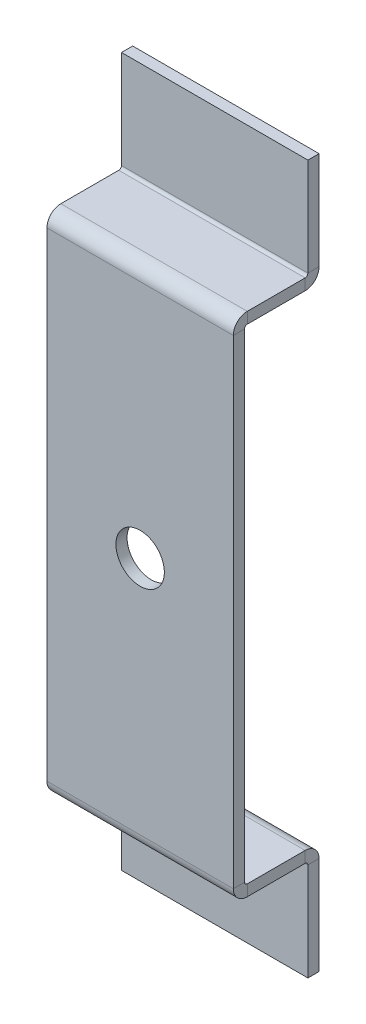
ISO-10303-21;
HEADER;
FILE_DESCRIPTION(('STEP AP214'),'2;1');
FILE_NAME('part.step','',(''),(''),'','','');
FILE_SCHEMA(('AUTOMOTIVE_DESIGN { 1 0 10303 214 1 1 1 1 }'));
ENDSEC;
DATA;
#1=APPLICATION_CONTEXT('core data for automotive mechanical design processes');
#2=APPLICATION_PROTOCOL_DEFINITION('international standard','automotive_design',2000,#1);
#3=PRODUCT_CONTEXT('',#1,'mechanical');
#4=PRODUCT('Part','Part','',(#3));
#5=PRODUCT_RELATED_PRODUCT_CATEGORY('part','',(#4));
#6=PRODUCT_DEFINITION_FORMATION('','',#4);
#7=PRODUCT_DEFINITION_CONTEXT('part definition',#1,'design');
#8=PRODUCT_DEFINITION('design','',#6,#7);
#9=PRODUCT_DEFINITION_SHAPE('','',#8);
#10=(LENGTH_UNIT() NAMED_UNIT(*) SI_UNIT(.MILLI.,.METRE.));
#11=(NAMED_UNIT(*) PLANE_ANGLE_UNIT() SI_UNIT($,.RADIAN.));
#12=(NAMED_UNIT(*) SI_UNIT($,.STERADIAN.) SOLID_ANGLE_UNIT());
#13=UNCERTAINTY_MEASURE_WITH_UNIT(LENGTH_MEASURE(1.E-05),#10,'distance_accuracy_value','');
#14=(GEOMETRIC_REPRESENTATION_CONTEXT(3) GLOBAL_UNCERTAINTY_ASSIGNED_CONTEXT((#13)) GLOBAL_UNIT_ASSIGNED_CONTEXT((#10,
#11,#12)) REPRESENTATION_CONTEXT('',''));
#15=CARTESIAN_POINT('',(0.,0.,0.));
#16=DIRECTION('',(0.,0.,1.));
#17=DIRECTION('',(1.,0.,0.));
#18=AXIS2_PLACEMENT_3D('',#15,#16,#17);
#19=CARTESIAN_POINT('',(0.,133.,-20.));
#20=DIRECTION('',(-1.,0.,0.));
#21=DIRECTION('',(0.,0.,1.));
#22=AXIS2_PLACEMENT_3D('',#19,#20,#21);
#23=PLANE('',#22);
#24=DIRECTION('',(0.,0.,-1.));
#25=VECTOR('',#24,1.);
#26=CARTESIAN_POINT('',(0.,133.,-20.));
#27=LINE('',#26,#25);
#28=CARTESIAN_POINT('',(0.,133.,-3.7366));
#29=VERTEX_POINT('',#28);
#30=CARTESIAN_POINT('',(0.,133.,-19.2634));
#31=VERTEX_POINT('',#30);
#32=EDGE_CURVE('E351',#29,#31,#27,.T.);
#33=ORIENTED_EDGE('',*,*,#32,.T.);
#34=DIRECTION('',(0.,-1.,0.));
#35=VECTOR('',#34,1.);
#36=CARTESIAN_POINT('',(0.,133.,-19.2634));
#37=LINE('',#36,#35);
#38=CARTESIAN_POINT('',(0.,130.,-19.2634));
#39=VERTEX_POINT('',#38);
#40=EDGE_CURVE('E233',#31,#39,#37,.T.);
#41=ORIENTED_EDGE('',*,*,#40,.T.);
#42=DIRECTION('',(0.,0.,-1.));
#43=VECTOR('',#42,1.);
#44=CARTESIAN_POINT('',(0.,130.,-20.));
#45=LINE('',#44,#43);
#46=CARTESIAN_POINT('',(0.,130.,-3.73660000000001));
#47=VERTEX_POINT('',#46);
#48=EDGE_CURVE('E350',#47,#39,#45,.T.);
#49=ORIENTED_EDGE('',*,*,#48,.F.);
#50=DIRECTION('',(0.,1.,0.));
#51=VECTOR('',#50,1.);
#52=CARTESIAN_POINT('',(0.,130.,-3.73660000000001));
#53=LINE('',#52,#51);
#54=EDGE_CURVE('E336',#47,#29,#53,.T.);
#55=ORIENTED_EDGE('',*,*,#54,.T.);
#56=EDGE_LOOP('',(#33,#41,#49,#55));
#57=FACE_BOUND('',#56,.T.);
#58=ADVANCED_FACE('F39',(#57),#23,.T.);
#59=CARTESIAN_POINT('',(0.,133.,4.34971482843795E-13));
#60=DIRECTION('',(0.,1.,0.));
#61=DIRECTION('',(0.,0.,1.));
#62=AXIS2_PLACEMENT_3D('',#59,#60,#61);
#63=PLANE('',#62);
#64=DIRECTION('',(0.,0.,1.));
#65=VECTOR('',#64,1.);
#66=CARTESIAN_POINT('',(50.,133.,-2.99999999999999));
#67=LINE('',#66,#65);
#68=CARTESIAN_POINT('',(50.,133.,-19.2634));
#69=VERTEX_POINT('',#68);
#70=CARTESIAN_POINT('',(50.,133.,-3.7366));
#71=VERTEX_POINT('',#70);
#72=EDGE_CURVE('E353',#69,#71,#67,.T.);
#73=ORIENTED_EDGE('',*,*,#72,.F.);
#74=DIRECTION('',(-1.,0.,0.));
#75=VECTOR('',#74,1.);
#76=CARTESIAN_POINT('',(0.,133.,-19.2634));
#77=LINE('',#76,#75);
#78=EDGE_CURVE('E63',#31,#69,#77,.F.);
#79=ORIENTED_EDGE('',*,*,#78,.F.);
#80=ORIENTED_EDGE('',*,*,#32,.F.);
#81=DIRECTION('',(1.,0.,0.));
#82=VECTOR('',#81,1.);
#83=CARTESIAN_POINT('',(0.,133.,-3.7366));
#84=LINE('',#83,#82);
#85=EDGE_CURVE('E345',#29,#71,#84,.T.);
#86=ORIENTED_EDGE('',*,*,#85,.T.);
#87=EDGE_LOOP('',(#73,#79,#80,#86));
#88=FACE_BOUND('',#87,.T.);
#89=ADVANCED_FACE('F400',(#88),#63,.T.);
#90=CARTESIAN_POINT('',(0.,130.,4.24497038827265E-13));
#91=DIRECTION('',(0.,1.,0.));
#92=DIRECTION('',(0.,0.,1.));
#93=AXIS2_PLACEMENT_3D('',#90,#91,#92);
#94=PLANE('',#93);
#95=DIRECTION('',(-1.,0.,0.));
#96=VECTOR('',#95,1.);
#97=CARTESIAN_POINT('',(0.,130.,-19.2634));
#98=LINE('',#97,#96);
#99=CARTESIAN_POINT('',(50.,130.,-19.2634));
#100=VERTEX_POINT('',#99);
#101=EDGE_CURVE('E186',#39,#100,#98,.F.);
#102=ORIENTED_EDGE('',*,*,#101,.T.);
#103=DIRECTION('',(0.,0.,1.));
#104=VECTOR('',#103,1.);
#105=CARTESIAN_POINT('',(50.,130.,-3.));
#106=LINE('',#105,#104);
#107=CARTESIAN_POINT('',(50.,130.,-3.73660000000001));
#108=VERTEX_POINT('',#107);
#109=EDGE_CURVE('E354',#100,#108,#106,.T.);
#110=ORIENTED_EDGE('',*,*,#109,.T.);
#111=DIRECTION('',(1.,0.,0.));
#112=VECTOR('',#111,1.);
#113=CARTESIAN_POINT('',(0.,130.,-3.73660000000001));
#114=LINE('',#113,#112);
#115=EDGE_CURVE('E339',#47,#108,#114,.T.);
#116=ORIENTED_EDGE('',*,*,#115,.F.);
#117=ORIENTED_EDGE('',*,*,#48,.T.);
#118=EDGE_LOOP('',(#102,#110,#116,#117));
#119=FACE_BOUND('',#118,.T.);
#120=ADVANCED_FACE('F408',(#119),#94,.F.);
#121=CARTESIAN_POINT('',(50.,-3.,-2.99999999999999));
#122=DIRECTION('',(1.,0.,0.));
#123=DIRECTION('',(0.,0.,-1.));
#124=AXIS2_PLACEMENT_3D('',#121,#122,#123);
#125=PLANE('',#124);
#126=DIRECTION('',(0.,0.,-1.));
#127=VECTOR('',#126,1.);
#128=CARTESIAN_POINT('',(50.,-3.,-2.99999999999999));
#129=LINE('',#128,#127);
#130=CARTESIAN_POINT('',(50.,-3.,-3.73659999999999));
#131=VERTEX_POINT('',#130);
#132=CARTESIAN_POINT('',(50.,-3.00000000000006,-19.2634));
#133=VERTEX_POINT('',#132);
#134=EDGE_CURVE('E306',#131,#133,#129,.T.);
#135=ORIENTED_EDGE('',*,*,#134,.T.);
#136=DIRECTION('',(0.,1.,0.));
#137=VECTOR('',#136,1.);
#138=CARTESIAN_POINT('',(50.,-3.00000000000006,-19.2634));
#139=LINE('',#138,#137);
#140=CARTESIAN_POINT('',(50.,0.,-19.2634));
#141=VERTEX_POINT('',#140);
#142=EDGE_CURVE('E279',#133,#141,#139,.T.);
#143=ORIENTED_EDGE('',*,*,#142,.T.);
#144=DIRECTION('',(0.,0.,-1.));
#145=VECTOR('',#144,1.);
#146=CARTESIAN_POINT('',(50.,0.,-3.));
#147=LINE('',#146,#145);
#148=CARTESIAN_POINT('',(50.,0.,-3.7366));
#149=VERTEX_POINT('',#148);
#150=EDGE_CURVE('E305',#149,#141,#147,.T.);
#151=ORIENTED_EDGE('',*,*,#150,.F.);
#152=DIRECTION('',(0.,-1.,0.));
#153=VECTOR('',#152,1.);
#154=CARTESIAN_POINT('',(50.,0.,-3.7366));
#155=LINE('',#154,#153);
#156=EDGE_CURVE('E292',#149,#131,#155,.T.);
#157=ORIENTED_EDGE('',*,*,#156,.T.);
#158=EDGE_LOOP('',(#135,#143,#151,#157));
#159=FACE_BOUND('',#158,.T.);
#160=ADVANCED_FACE('F432',(#159),#125,.T.);
#161=CARTESIAN_POINT('',(0.,-2.99999999999999,0.));
#162=DIRECTION('',(0.,1.,0.));
#163=DIRECTION('',(0.,0.,1.));
#164=AXIS2_PLACEMENT_3D('',#161,#162,#163);
#165=PLANE('',#164);
#166=DIRECTION('',(1.,0.,0.));
#167=VECTOR('',#166,1.);
#168=CARTESIAN_POINT('',(50.,-3.00000000000006,-19.2634));
#169=LINE('',#168,#167);
#170=CARTESIAN_POINT('',(0.,-3.00000000000006,-19.2634));
#171=VERTEX_POINT('',#170);
#172=EDGE_CURVE('E285',#133,#171,#169,.F.);
#173=ORIENTED_EDGE('',*,*,#172,.F.);
#174=ORIENTED_EDGE('',*,*,#134,.F.);
#175=DIRECTION('',(1.,0.,0.));
#176=VECTOR('',#175,1.);
#177=CARTESIAN_POINT('',(0.,-3.,-3.73659999999999));
#178=LINE('',#177,#176);
#179=CARTESIAN_POINT('',(0.,-3.,-3.73659999999999));
#180=VERTEX_POINT('',#179);
#181=EDGE_CURVE('E301',#180,#131,#178,.T.);
#182=ORIENTED_EDGE('',*,*,#181,.F.);
#183=DIRECTION('',(0.,0.,1.));
#184=VECTOR('',#183,1.);
#185=CARTESIAN_POINT('',(0.,-3.00000000000006,-20.));
#186=LINE('',#185,#184);
#187=EDGE_CURVE('E309',#171,#180,#186,.T.);
#188=ORIENTED_EDGE('',*,*,#187,.F.);
#189=EDGE_LOOP('',(#173,#174,#182,#188));
#190=FACE_BOUND('',#189,.T.);
#191=ADVANCED_FACE('F445',(#190),#165,.F.);
#192=CARTESIAN_POINT('',(0.,0.,0.));
#193=DIRECTION('',(0.,1.,0.));
#194=DIRECTION('',(0.,0.,1.));
#195=AXIS2_PLACEMENT_3D('',#192,#193,#194);
#196=PLANE('',#195);
#197=ORIENTED_EDGE('',*,*,#150,.T.);
#198=DIRECTION('',(1.,0.,0.));
#199=VECTOR('',#198,1.);
#200=CARTESIAN_POINT('',(50.,0.,-19.2634));
#201=LINE('',#200,#199);
#202=CARTESIAN_POINT('',(0.,0.,-19.2634));
#203=VERTEX_POINT('',#202);
#204=EDGE_CURVE('E272',#141,#203,#201,.F.);
#205=ORIENTED_EDGE('',*,*,#204,.T.);
#206=DIRECTION('',(0.,0.,1.));
#207=VECTOR('',#206,1.);
#208=CARTESIAN_POINT('',(0.,0.,-20.));
#209=LINE('',#208,#207);
#210=CARTESIAN_POINT('',(0.,0.,-3.7366));
#211=VERTEX_POINT('',#210);
#212=EDGE_CURVE('E310',#203,#211,#209,.T.);
#213=ORIENTED_EDGE('',*,*,#212,.T.);
#214=DIRECTION('',(-1.,0.,0.));
#215=VECTOR('',#214,1.);
#216=CARTESIAN_POINT('',(50.,0.,-3.7366));
#217=LINE('',#216,#215);
#218=EDGE_CURVE('E295',#149,#211,#217,.T.);
#219=ORIENTED_EDGE('',*,*,#218,.F.);
#220=EDGE_LOOP('',(#197,#205,#213,#219));
#221=FACE_BOUND('',#220,.T.);
#222=ADVANCED_FACE('F429',(#221),#196,.T.);
#223=CARTESIAN_POINT('',(0.,0.,-3.));
#224=DIRECTION('',(0.,0.,-1.));
#225=DIRECTION('',(-1.,0.,0.));
#226=AXIS2_PLACEMENT_3D('',#223,#224,#225);
#227=PLANE('',#226);
#228=CARTESIAN_POINT('',(25.,64.9999999999999,-3.));
#229=DIRECTION('',(0.,0.,-1.));
#230=DIRECTION('',(-1.,0.,0.));
#231=AXIS2_PLACEMENT_3D('',#228,#229,#230);
#232=CIRCLE('',#231,6.50000000000001);
#233=CARTESIAN_POINT('',(18.5,64.9999999999999,-3.));
#234=VERTEX_POINT('',#233);
#235=EDGE_CURVE('E489',#234,#234,#232,.T.);
#236=ORIENTED_EDGE('',*,*,#235,.F.);
#237=EDGE_LOOP('',(#236));
#238=FACE_BOUND('',#237,.T.);
#239=DIRECTION('',(0.,1.,0.));
#240=VECTOR('',#239,1.);
#241=CARTESIAN_POINT('',(50.,0.,-3.));
#242=LINE('',#241,#240);
#243=CARTESIAN_POINT('',(50.,0.736600000000001,-3.));
#244=VERTEX_POINT('',#243);
#245=CARTESIAN_POINT('',(50.,129.2634,-3.));
#246=VERTEX_POINT('',#245);
#247=EDGE_CURVE('E11',#244,#246,#242,.T.);
#248=ORIENTED_EDGE('',*,*,#247,.F.);
#249=DIRECTION('',(-1.,0.,0.));
#250=VECTOR('',#249,1.);
#251=CARTESIAN_POINT('',(0.,0.736599999999997,-3.));
#252=LINE('',#251,#250);
#253=CARTESIAN_POINT('',(0.,0.736599999999997,-3.));
#254=VERTEX_POINT('',#253);
#255=EDGE_CURVE('E328',#254,#244,#252,.F.);
#256=ORIENTED_EDGE('',*,*,#255,.F.);
#257=DIRECTION('',(0.,-1.,0.));
#258=VECTOR('',#257,1.);
#259=CARTESIAN_POINT('',(0.,0.,-3.));
#260=LINE('',#259,#258);
#261=CARTESIAN_POINT('',(0.,129.2634,-3.));
#262=VERTEX_POINT('',#261);
#263=EDGE_CURVE('E48',#262,#254,#260,.T.);
#264=ORIENTED_EDGE('',*,*,#263,.F.);
#265=DIRECTION('',(1.,0.,0.));
#266=VECTOR('',#265,1.);
#267=CARTESIAN_POINT('',(50.,129.2634,-3.));
#268=LINE('',#267,#266);
#269=EDGE_CURVE('E372',#246,#262,#268,.F.);
#270=ORIENTED_EDGE('',*,*,#269,.F.);
#271=EDGE_LOOP('',(#248,#256,#264,#270));
#272=FACE_BOUND('',#271,.T.);
#273=ADVANCED_FACE('F415',(#238,#272),#227,.T.);
#274=CARTESIAN_POINT('',(0.,0.,0.));
#275=DIRECTION('',(0.,0.,-1.));
#276=DIRECTION('',(-1.,0.,0.));
#277=AXIS2_PLACEMENT_3D('',#274,#275,#276);
#278=PLANE('',#277);
#279=CARTESIAN_POINT('',(25.,64.9999999999999,0.));
#280=DIRECTION('',(0.,0.,1.));
#281=DIRECTION('',(1.,0.,0.));
#282=AXIS2_PLACEMENT_3D('',#279,#280,#281);
#283=CIRCLE('',#282,6.50000000000001);
#284=CARTESIAN_POINT('',(31.5,64.9999999999999,0.));
#285=VERTEX_POINT('',#284);
#286=EDGE_CURVE('E487',#285,#285,#283,.T.);
#287=ORIENTED_EDGE('',*,*,#286,.F.);
#288=EDGE_LOOP('',(#287));
#289=FACE_BOUND('',#288,.T.);
#290=DIRECTION('',(-1.,0.,0.));
#291=VECTOR('',#290,1.);
#292=CARTESIAN_POINT('',(0.,0.736600000000005,0.));
#293=LINE('',#292,#291);
#294=CARTESIAN_POINT('',(0.,0.736600000000005,0.));
#295=VERTEX_POINT('',#294);
#296=CARTESIAN_POINT('',(50.,0.736600000000001,0.));
#297=VERTEX_POINT('',#296);
#298=EDGE_CURVE('E316',#295,#297,#293,.F.);
#299=ORIENTED_EDGE('',*,*,#298,.T.);
#300=DIRECTION('',(0.,1.,0.));
#301=VECTOR('',#300,1.);
#302=CARTESIAN_POINT('',(50.,0.,0.));
#303=LINE('',#302,#301);
#304=CARTESIAN_POINT('',(50.,129.2634,0.));
#305=VERTEX_POINT('',#304);
#306=EDGE_CURVE('E43',#297,#305,#303,.T.);
#307=ORIENTED_EDGE('',*,*,#306,.T.);
#308=DIRECTION('',(1.,0.,0.));
#309=VECTOR('',#308,1.);
#310=CARTESIAN_POINT('',(50.,129.2634,0.));
#311=LINE('',#310,#309);
#312=CARTESIAN_POINT('',(0.,129.2634,0.));
#313=VERTEX_POINT('',#312);
#314=EDGE_CURVE('E360',#305,#313,#311,.F.);
#315=ORIENTED_EDGE('',*,*,#314,.T.);
#316=DIRECTION('',(0.,-1.,0.));
#317=VECTOR('',#316,1.);
#318=CARTESIAN_POINT('',(0.,0.,0.));
#319=LINE('',#318,#317);
#320=EDGE_CURVE('E380',#313,#295,#319,.T.);
#321=ORIENTED_EDGE('',*,*,#320,.T.);
#322=EDGE_LOOP('',(#299,#307,#315,#321));
#323=FACE_BOUND('',#322,.T.);
#324=ADVANCED_FACE('F388',(#289,#323),#278,.F.);
#325=CARTESIAN_POINT('',(0.,0.,-3.));
#326=DIRECTION('',(-1.,0.,0.));
#327=DIRECTION('',(0.,-1.,0.));
#328=AXIS2_PLACEMENT_3D('',#325,#326,#327);
#329=PLANE('',#328);
#330=ORIENTED_EDGE('',*,*,#263,.T.);
#331=DIRECTION('',(0.,0.,1.));
#332=VECTOR('',#331,1.);
#333=CARTESIAN_POINT('',(0.,0.736599999999997,-3.));
#334=LINE('',#333,#332);
#335=EDGE_CURVE('E322',#254,#295,#334,.T.);
#336=ORIENTED_EDGE('',*,*,#335,.T.);
#337=ORIENTED_EDGE('',*,*,#320,.F.);
#338=DIRECTION('',(0.,0.,1.));
#339=VECTOR('',#338,1.);
#340=CARTESIAN_POINT('',(0.,129.2634,-3.));
#341=LINE('',#340,#339);
#342=EDGE_CURVE('E377',#262,#313,#341,.T.);
#343=ORIENTED_EDGE('',*,*,#342,.F.);
#344=EDGE_LOOP('',(#330,#336,#337,#343));
#345=FACE_BOUND('',#344,.T.);
#346=ADVANCED_FACE('F41',(#345),#329,.T.);
#347=CARTESIAN_POINT('',(50.,0.,-3.));
#348=DIRECTION('',(1.,0.,0.));
#349=DIRECTION('',(0.,1.,0.));
#350=AXIS2_PLACEMENT_3D('',#347,#348,#349);
#351=PLANE('',#350);
#352=DIRECTION('',(0.,0.,1.));
#353=VECTOR('',#352,1.);
#354=CARTESIAN_POINT('',(50.,0.736600000000001,-3.));
#355=LINE('',#354,#353);
#356=EDGE_CURVE('E333',#244,#297,#355,.T.);
#357=ORIENTED_EDGE('',*,*,#356,.F.);
#358=ORIENTED_EDGE('',*,*,#247,.T.);
#359=DIRECTION('',(0.,0.,1.));
#360=VECTOR('',#359,1.);
#361=CARTESIAN_POINT('',(50.,129.2634,-3.));
#362=LINE('',#361,#360);
#363=EDGE_CURVE('E366',#246,#305,#362,.T.);
#364=ORIENTED_EDGE('',*,*,#363,.T.);
#365=ORIENTED_EDGE('',*,*,#306,.F.);
#366=EDGE_LOOP('',(#357,#358,#364,#365));
#367=FACE_BOUND('',#366,.T.);
#368=ADVANCED_FACE('F455',(#367),#351,.T.);
#369=CARTESIAN_POINT('',(0.,129.2634,-3.73660000000001));
#370=DIRECTION('',(-1.,0.,0.));
#371=DIRECTION('',(0.,0.,1.));
#372=AXIS2_PLACEMENT_3D('',#369,#370,#371);
#373=PLANE('',#372);
#374=ORIENTED_EDGE('',*,*,#54,.F.);
#375=CARTESIAN_POINT('',(0.,129.2634,-3.73660000000001));
#376=DIRECTION('',(1.,0.,0.));
#377=DIRECTION('',(0.,0.,-1.));
#378=AXIS2_PLACEMENT_3D('',#375,#376,#377);
#379=CIRCLE('',#378,0.736600000000004);
#380=EDGE_CURVE('E369',#262,#47,#379,.F.);
#381=ORIENTED_EDGE('',*,*,#380,.F.);
#382=ORIENTED_EDGE('',*,*,#342,.T.);
#383=CARTESIAN_POINT('',(0.,129.2634,-3.73660000000001));
#384=DIRECTION('',(1.,0.,0.));
#385=DIRECTION('',(0.,0.,-1.));
#386=AXIS2_PLACEMENT_3D('',#383,#384,#385);
#387=CIRCLE('',#386,3.7366);
#388=EDGE_CURVE('E362',#313,#29,#387,.F.);
#389=ORIENTED_EDGE('',*,*,#388,.T.);
#390=EDGE_LOOP('',(#374,#381,#382,#389));
#391=FACE_BOUND('',#390,.T.);
#392=ADVANCED_FACE('F402',(#391),#373,.T.);
#393=CARTESIAN_POINT('',(50.,129.2634,-3.73660000000001));
#394=DIRECTION('',(-1.,0.,0.));
#395=DIRECTION('',(0.,0.,1.));
#396=AXIS2_PLACEMENT_3D('',#393,#394,#395);
#397=PLANE('',#396);
#398=CARTESIAN_POINT('',(50.,129.2634,-3.73660000000001));
#399=DIRECTION('',(1.,0.,0.));
#400=DIRECTION('',(0.,0.,-1.));
#401=AXIS2_PLACEMENT_3D('',#398,#399,#400);
#402=CIRCLE('',#401,0.736600000000004);
#403=EDGE_CURVE('E356',#108,#246,#402,.T.);
#404=ORIENTED_EDGE('',*,*,#403,.F.);
#405=DIRECTION('',(0.,1.,0.));
#406=VECTOR('',#405,1.);
#407=CARTESIAN_POINT('',(50.,130.,-3.73660000000001));
#408=LINE('',#407,#406);
#409=EDGE_CURVE('E342',#108,#71,#408,.T.);
#410=ORIENTED_EDGE('',*,*,#409,.T.);
#411=CARTESIAN_POINT('',(50.,129.2634,-3.73660000000001));
#412=DIRECTION('',(1.,0.,0.));
#413=DIRECTION('',(0.,0.,-1.));
#414=AXIS2_PLACEMENT_3D('',#411,#412,#413);
#415=CIRCLE('',#414,3.7366);
#416=EDGE_CURVE('E363',#71,#305,#415,.T.);
#417=ORIENTED_EDGE('',*,*,#416,.T.);
#418=ORIENTED_EDGE('',*,*,#363,.F.);
#419=EDGE_LOOP('',(#404,#410,#417,#418));
#420=FACE_BOUND('',#419,.T.);
#421=ADVANCED_FACE('F398',(#420),#397,.F.);
#422=CARTESIAN_POINT('',(50.,129.2634,-3.73660000000001));
#423=DIRECTION('',(1.,0.,0.));
#424=DIRECTION('',(0.,1.,0.));
#425=AXIS2_PLACEMENT_3D('',#422,#423,#424);
#426=CYLINDRICAL_SURFACE('',#425,3.7366);
#427=ORIENTED_EDGE('',*,*,#314,.F.);
#428=ORIENTED_EDGE('',*,*,#416,.F.);
#429=ORIENTED_EDGE('',*,*,#85,.F.);
#430=ORIENTED_EDGE('',*,*,#388,.F.);
#431=EDGE_LOOP('',(#427,#428,#429,#430));
#432=FACE_BOUND('',#431,.T.);
#433=ADVANCED_FACE('F394',(#432),#426,.T.);
#434=CARTESIAN_POINT('',(50.,129.2634,-3.73660000000001));
#435=DIRECTION('',(1.,0.,0.));
#436=DIRECTION('',(0.,1.,0.));
#437=AXIS2_PLACEMENT_3D('',#434,#435,#436);
#438=CYLINDRICAL_SURFACE('',#437,0.736600000000004);
#439=ORIENTED_EDGE('',*,*,#269,.T.);
#440=ORIENTED_EDGE('',*,*,#380,.T.);
#441=ORIENTED_EDGE('',*,*,#115,.T.);
#442=ORIENTED_EDGE('',*,*,#403,.T.);
#443=EDGE_LOOP('',(#439,#440,#441,#442));
#444=FACE_BOUND('',#443,.T.);
#445=ADVANCED_FACE('F410',(#444),#438,.F.);
#446=CARTESIAN_POINT('',(50.,133.,-2.99999999999999));
#447=DIRECTION('',(1.,0.,0.));
#448=DIRECTION('',(0.,0.,-1.));
#449=AXIS2_PLACEMENT_3D('',#446,#447,#448);
#450=PLANE('',#449);
#451=DIRECTION('',(0.,-1.,0.));
#452=VECTOR('',#451,1.);
#453=CARTESIAN_POINT('',(50.,133.,-19.2634));
#454=LINE('',#453,#452);
#455=EDGE_CURVE('E56',#69,#100,#454,.T.);
#456=ORIENTED_EDGE('',*,*,#455,.F.);
#457=ORIENTED_EDGE('',*,*,#72,.T.);
#458=ORIENTED_EDGE('',*,*,#409,.F.);
#459=ORIENTED_EDGE('',*,*,#109,.F.);
#460=EDGE_LOOP('',(#456,#457,#458,#459));
#461=FACE_BOUND('',#460,.T.);
#462=ADVANCED_FACE('F471',(#461),#450,.T.);
#463=CARTESIAN_POINT('',(50.,0.736599999999999,-3.7366));
#464=DIRECTION('',(1.,0.,0.));
#465=DIRECTION('',(0.,1.,0.));
#466=AXIS2_PLACEMENT_3D('',#463,#464,#465);
#467=PLANE('',#466);
#468=ORIENTED_EDGE('',*,*,#156,.F.);
#469=CARTESIAN_POINT('',(50.,0.736599999999999,-3.7366));
#470=DIRECTION('',(-1.,0.,0.));
#471=DIRECTION('',(0.,-1.,0.));
#472=AXIS2_PLACEMENT_3D('',#469,#470,#471);
#473=CIRCLE('',#472,0.736600000000002);
#474=EDGE_CURVE('E325',#244,#149,#473,.F.);
#475=ORIENTED_EDGE('',*,*,#474,.F.);
#476=ORIENTED_EDGE('',*,*,#356,.T.);
#477=CARTESIAN_POINT('',(50.,0.736599999999999,-3.7366));
#478=DIRECTION('',(-1.,0.,0.));
#479=DIRECTION('',(0.,-1.,0.));
#480=AXIS2_PLACEMENT_3D('',#477,#478,#479);
#481=CIRCLE('',#480,3.7366);
#482=EDGE_CURVE('E318',#297,#131,#481,.F.);
#483=ORIENTED_EDGE('',*,*,#482,.T.);
#484=EDGE_LOOP('',(#468,#475,#476,#483));
#485=FACE_BOUND('',#484,.T.);
#486=ADVANCED_FACE('F454',(#485),#467,.T.);
#487=CARTESIAN_POINT('',(0.,0.736599999999996,-3.7366));
#488=DIRECTION('',(1.,0.,0.));
#489=DIRECTION('',(0.,1.,0.));
#490=AXIS2_PLACEMENT_3D('',#487,#488,#489);
#491=PLANE('',#490);
#492=CARTESIAN_POINT('',(0.,0.736599999999996,-3.7366));
#493=DIRECTION('',(-1.,0.,0.));
#494=DIRECTION('',(0.,-1.,0.));
#495=AXIS2_PLACEMENT_3D('',#492,#493,#494);
#496=CIRCLE('',#495,0.736600000000002);
#497=EDGE_CURVE('E312',#211,#254,#496,.T.);
#498=ORIENTED_EDGE('',*,*,#497,.F.);
#499=DIRECTION('',(0.,-1.,0.));
#500=VECTOR('',#499,1.);
#501=CARTESIAN_POINT('',(0.,0.,-3.7366));
#502=LINE('',#501,#500);
#503=EDGE_CURVE('E298',#211,#180,#502,.T.);
#504=ORIENTED_EDGE('',*,*,#503,.T.);
#505=CARTESIAN_POINT('',(0.,0.736599999999996,-3.7366));
#506=DIRECTION('',(-1.,0.,0.));
#507=DIRECTION('',(0.,-1.,0.));
#508=AXIS2_PLACEMENT_3D('',#505,#506,#507);
#509=CIRCLE('',#508,3.7366);
#510=EDGE_CURVE('E319',#180,#295,#509,.T.);
#511=ORIENTED_EDGE('',*,*,#510,.T.);
#512=ORIENTED_EDGE('',*,*,#335,.F.);
#513=EDGE_LOOP('',(#498,#504,#511,#512));
#514=FACE_BOUND('',#513,.T.);
#515=ADVANCED_FACE('F420',(#514),#491,.F.);
#516=CARTESIAN_POINT('',(0.,0.736599999999996,-3.7366));
#517=DIRECTION('',(-1.,0.,0.));
#518=DIRECTION('',(0.,-1.,0.));
#519=AXIS2_PLACEMENT_3D('',#516,#517,#518);
#520=CYLINDRICAL_SURFACE('',#519,3.7366);
#521=ORIENTED_EDGE('',*,*,#298,.F.);
#522=ORIENTED_EDGE('',*,*,#510,.F.);
#523=ORIENTED_EDGE('',*,*,#181,.T.);
#524=ORIENTED_EDGE('',*,*,#482,.F.);
#525=EDGE_LOOP('',(#521,#522,#523,#524));
#526=FACE_BOUND('',#525,.T.);
#527=ADVANCED_FACE('F451',(#526),#520,.T.);
#528=CARTESIAN_POINT('',(0.,0.736599999999996,-3.7366));
#529=DIRECTION('',(-1.,0.,0.));
#530=DIRECTION('',(0.,-1.,0.));
#531=AXIS2_PLACEMENT_3D('',#528,#529,#530);
#532=CYLINDRICAL_SURFACE('',#531,0.736600000000002);
#533=ORIENTED_EDGE('',*,*,#255,.T.);
#534=ORIENTED_EDGE('',*,*,#474,.T.);
#535=ORIENTED_EDGE('',*,*,#218,.T.);
#536=ORIENTED_EDGE('',*,*,#497,.T.);
#537=EDGE_LOOP('',(#533,#534,#535,#536));
#538=FACE_BOUND('',#537,.T.);
#539=ADVANCED_FACE('F424',(#538),#532,.F.);
#540=CARTESIAN_POINT('',(0.,-3.00000000000006,-20.));
#541=DIRECTION('',(-1.,0.,0.));
#542=DIRECTION('',(0.,0.,1.));
#543=AXIS2_PLACEMENT_3D('',#540,#541,#542);
#544=PLANE('',#543);
#545=DIRECTION('',(0.,1.,0.));
#546=VECTOR('',#545,1.);
#547=CARTESIAN_POINT('',(0.,-3.00000000000006,-19.2634));
#548=LINE('',#547,#546);
#549=EDGE_CURVE('E289',#171,#203,#548,.T.);
#550=ORIENTED_EDGE('',*,*,#549,.F.);
#551=ORIENTED_EDGE('',*,*,#187,.T.);
#552=ORIENTED_EDGE('',*,*,#503,.F.);
#553=ORIENTED_EDGE('',*,*,#212,.F.);
#554=EDGE_LOOP('',(#550,#551,#552,#553));
#555=FACE_BOUND('',#554,.T.);
#556=ADVANCED_FACE('F449',(#555),#544,.T.);
#557=CARTESIAN_POINT('',(0.,-3.73660000000006,-19.2634));
#558=DIRECTION('',(-1.,0.,0.));
#559=DIRECTION('',(0.,0.,1.));
#560=AXIS2_PLACEMENT_3D('',#557,#558,#559);
#561=PLANE('',#560);
#562=DIRECTION('',(0.,0.,-1.));
#563=VECTOR('',#562,1.);
#564=CARTESIAN_POINT('',(0.,-3.73660000000006,-20.));
#565=LINE('',#564,#563);
#566=CARTESIAN_POINT('',(0.,-3.73660000000006,-20.));
#567=VERTEX_POINT('',#566);
#568=CARTESIAN_POINT('',(0.,-3.73660000000006,-23.));
#569=VERTEX_POINT('',#568);
#570=EDGE_CURVE('E240',#567,#569,#565,.T.);
#571=ORIENTED_EDGE('',*,*,#570,.F.);
#572=CARTESIAN_POINT('',(0.,-3.73660000000006,-19.2634));
#573=DIRECTION('',(1.,0.,0.));
#574=DIRECTION('',(0.,0.,-1.));
#575=AXIS2_PLACEMENT_3D('',#572,#573,#574);
#576=CIRCLE('',#575,0.7366);
#577=EDGE_CURVE('E282',#171,#567,#576,.F.);
#578=ORIENTED_EDGE('',*,*,#577,.F.);
#579=ORIENTED_EDGE('',*,*,#549,.T.);
#580=CARTESIAN_POINT('',(0.,-3.73660000000006,-19.2634));
#581=DIRECTION('',(1.,0.,0.));
#582=DIRECTION('',(0.,0.,-1.));
#583=AXIS2_PLACEMENT_3D('',#580,#581,#582);
#584=CIRCLE('',#583,3.7366);
#585=EDGE_CURVE('E275',#203,#569,#584,.F.);
#586=ORIENTED_EDGE('',*,*,#585,.T.);
#587=EDGE_LOOP('',(#571,#578,#579,#586));
#588=FACE_BOUND('',#587,.T.);
#589=ADVANCED_FACE('F559',(#588),#561,.T.);
#590=CARTESIAN_POINT('',(50.,-3.73660000000006,-19.2634));
#591=DIRECTION('',(-1.,0.,0.));
#592=DIRECTION('',(0.,0.,1.));
#593=AXIS2_PLACEMENT_3D('',#590,#591,#592);
#594=PLANE('',#593);
#595=CARTESIAN_POINT('',(50.,-3.73660000000006,-19.2634));
#596=DIRECTION('',(1.,0.,0.));
#597=DIRECTION('',(0.,0.,-1.));
#598=AXIS2_PLACEMENT_3D('',#595,#596,#597);
#599=CIRCLE('',#598,0.7366);
#600=CARTESIAN_POINT('',(50.,-3.73660000000006,-20.));
#601=VERTEX_POINT('',#600);
#602=EDGE_CURVE('E271',#601,#133,#599,.T.);
#603=ORIENTED_EDGE('',*,*,#602,.F.);
#604=DIRECTION('',(0.,0.,-1.));
#605=VECTOR('',#604,1.);
#606=CARTESIAN_POINT('',(50.,-3.73660000000006,-20.));
#607=LINE('',#606,#605);
#608=CARTESIAN_POINT('',(50.,-3.73660000000003,-23.));
#609=VERTEX_POINT('',#608);
#610=EDGE_CURVE('E244',#601,#609,#607,.T.);
#611=ORIENTED_EDGE('',*,*,#610,.T.);
#612=CARTESIAN_POINT('',(50.,-3.73660000000006,-19.2634));
#613=DIRECTION('',(1.,0.,0.));
#614=DIRECTION('',(0.,0.,-1.));
#615=AXIS2_PLACEMENT_3D('',#612,#613,#614);
#616=CIRCLE('',#615,3.7366);
#617=EDGE_CURVE('E276',#609,#141,#616,.T.);
#618=ORIENTED_EDGE('',*,*,#617,.T.);
#619=ORIENTED_EDGE('',*,*,#142,.F.);
#620=EDGE_LOOP('',(#603,#611,#618,#619));
#621=FACE_BOUND('',#620,.T.);
#622=ADVANCED_FACE('F436',(#621),#594,.F.);
#623=CARTESIAN_POINT('',(50.,-3.73660000000006,-19.2634));
#624=DIRECTION('',(1.,0.,0.));
#625=DIRECTION('',(0.,0.,-1.));
#626=AXIS2_PLACEMENT_3D('',#623,#624,#625);
#627=CYLINDRICAL_SURFACE('',#626,3.7366);
#628=ORIENTED_EDGE('',*,*,#204,.F.);
#629=ORIENTED_EDGE('',*,*,#617,.F.);
#630=DIRECTION('',(-1.,0.,0.));
#631=VECTOR('',#630,1.);
#632=CARTESIAN_POINT('',(0.,-3.73660000000003,-23.));
#633=LINE('',#632,#631);
#634=EDGE_CURVE('E247',#609,#569,#633,.T.);
#635=ORIENTED_EDGE('',*,*,#634,.T.);
#636=ORIENTED_EDGE('',*,*,#585,.F.);
#637=EDGE_LOOP('',(#628,#629,#635,#636));
#638=FACE_BOUND('',#637,.T.);
#639=ADVANCED_FACE('F553',(#638),#627,.T.);
#640=CARTESIAN_POINT('',(50.,-3.73660000000006,-19.2634));
#641=DIRECTION('',(1.,0.,0.));
#642=DIRECTION('',(0.,0.,-1.));
#643=AXIS2_PLACEMENT_3D('',#640,#641,#642);
#644=CYLINDRICAL_SURFACE('',#643,0.7366);
#645=ORIENTED_EDGE('',*,*,#172,.T.);
#646=ORIENTED_EDGE('',*,*,#577,.T.);
#647=DIRECTION('',(1.,0.,0.));
#648=VECTOR('',#647,1.);
#649=CARTESIAN_POINT('',(0.,-3.73660000000006,-20.));
#650=LINE('',#649,#648);
#651=EDGE_CURVE('E242',#567,#601,#650,.T.);
#652=ORIENTED_EDGE('',*,*,#651,.T.);
#653=ORIENTED_EDGE('',*,*,#602,.T.);
#654=EDGE_LOOP('',(#645,#646,#652,#653));
#655=FACE_BOUND('',#654,.T.);
#656=ADVANCED_FACE('F440',(#655),#644,.F.);
#657=CARTESIAN_POINT('',(50.,-30.0000000000001,-23.));
#658=DIRECTION('',(-1.,0.,0.));
#659=DIRECTION('',(0.,0.,1.));
#660=AXIS2_PLACEMENT_3D('',#657,#658,#659);
#661=PLANE('',#660);
#662=ORIENTED_EDGE('',*,*,#610,.F.);
#663=DIRECTION('',(0.,-1.,0.));
#664=VECTOR('',#663,1.);
#665=CARTESIAN_POINT('',(50.,-30.0000000000001,-20.));
#666=LINE('',#665,#664);
#667=CARTESIAN_POINT('',(50.,-30.0000000000001,-20.));
#668=VERTEX_POINT('',#667);
#669=EDGE_CURVE('E251',#601,#668,#666,.T.);
#670=ORIENTED_EDGE('',*,*,#669,.T.);
#671=DIRECTION('',(0.,0.,1.));
#672=VECTOR('',#671,1.);
#673=CARTESIAN_POINT('',(50.,-30.0000000000001,-23.));
#674=LINE('',#673,#672);
#675=CARTESIAN_POINT('',(50.,-30.0000000000001,-23.));
#676=VERTEX_POINT('',#675);
#677=EDGE_CURVE('E268',#676,#668,#674,.T.);
#678=ORIENTED_EDGE('',*,*,#677,.F.);
#679=DIRECTION('',(0.,-1.,0.));
#680=VECTOR('',#679,1.);
#681=CARTESIAN_POINT('',(50.,-30.0000000000001,-23.));
#682=LINE('',#681,#680);
#683=EDGE_CURVE('E252',#609,#676,#682,.T.);
#684=ORIENTED_EDGE('',*,*,#683,.F.);
#685=EDGE_LOOP('',(#662,#670,#678,#684));
#686=FACE_BOUND('',#685,.T.);
#687=ADVANCED_FACE('F545',(#686),#661,.F.);
#688=CARTESIAN_POINT('',(0.,-3.00000000000006,-23.));
#689=DIRECTION('',(1.,0.,0.));
#690=DIRECTION('',(0.,0.,-1.));
#691=AXIS2_PLACEMENT_3D('',#688,#689,#690);
#692=PLANE('',#691);
#693=ORIENTED_EDGE('',*,*,#570,.T.);
#694=DIRECTION('',(0.,1.,0.));
#695=VECTOR('',#694,1.);
#696=CARTESIAN_POINT('',(0.,-3.00000000000006,-23.));
#697=LINE('',#696,#695);
#698=CARTESIAN_POINT('',(0.,-30.0000000000001,-23.));
#699=VERTEX_POINT('',#698);
#700=EDGE_CURVE('E257',#699,#569,#697,.T.);
#701=ORIENTED_EDGE('',*,*,#700,.F.);
#702=DIRECTION('',(0.,0.,1.));
#703=VECTOR('',#702,1.);
#704=CARTESIAN_POINT('',(0.,-30.0000000000001,-23.));
#705=LINE('',#704,#703);
#706=CARTESIAN_POINT('',(0.,-30.0000000000001,-20.));
#707=VERTEX_POINT('',#706);
#708=EDGE_CURVE('E260',#699,#707,#705,.T.);
#709=ORIENTED_EDGE('',*,*,#708,.T.);
#710=DIRECTION('',(0.,1.,0.));
#711=VECTOR('',#710,1.);
#712=CARTESIAN_POINT('',(0.,-3.00000000000006,-20.));
#713=LINE('',#712,#711);
#714=EDGE_CURVE('E255',#707,#567,#713,.T.);
#715=ORIENTED_EDGE('',*,*,#714,.T.);
#716=EDGE_LOOP('',(#693,#701,#709,#715));
#717=FACE_BOUND('',#716,.T.);
#718=ADVANCED_FACE('F538',(#717),#692,.F.);
#719=CARTESIAN_POINT('',(0.,0.,-23.));
#720=DIRECTION('',(0.,0.,1.));
#721=DIRECTION('',(1.,0.,0.));
#722=AXIS2_PLACEMENT_3D('',#719,#720,#721);
#723=PLANE('',#722);
#724=ORIENTED_EDGE('',*,*,#634,.F.);
#725=ORIENTED_EDGE('',*,*,#683,.T.);
#726=DIRECTION('',(-1.,0.,0.));
#727=VECTOR('',#726,1.);
#728=CARTESIAN_POINT('',(0.,-30.0000000000001,-23.));
#729=LINE('',#728,#727);
#730=EDGE_CURVE('E254',#676,#699,#729,.T.);
#731=ORIENTED_EDGE('',*,*,#730,.T.);
#732=ORIENTED_EDGE('',*,*,#700,.T.);
#733=EDGE_LOOP('',(#724,#725,#731,#732));
#734=FACE_BOUND('',#733,.T.);
#735=ADVANCED_FACE('F534',(#734),#723,.F.);
#736=CARTESIAN_POINT('',(0.,0.,-20.));
#737=DIRECTION('',(0.,0.,1.));
#738=DIRECTION('',(1.,0.,0.));
#739=AXIS2_PLACEMENT_3D('',#736,#737,#738);
#740=PLANE('',#739);
#741=ORIENTED_EDGE('',*,*,#669,.F.);
#742=ORIENTED_EDGE('',*,*,#651,.F.);
#743=ORIENTED_EDGE('',*,*,#714,.F.);
#744=DIRECTION('',(-1.,0.,0.));
#745=VECTOR('',#744,1.);
#746=CARTESIAN_POINT('',(0.,-30.0000000000001,-20.));
#747=LINE('',#746,#745);
#748=EDGE_CURVE('E262',#668,#707,#747,.T.);
#749=ORIENTED_EDGE('',*,*,#748,.F.);
#750=EDGE_LOOP('',(#741,#742,#743,#749));
#751=FACE_BOUND('',#750,.T.);
#752=ADVANCED_FACE('F537',(#751),#740,.T.);
#753=CARTESIAN_POINT('',(0.,-30.0000000000001,-23.));
#754=DIRECTION('',(0.,1.,0.));
#755=DIRECTION('',(0.,0.,1.));
#756=AXIS2_PLACEMENT_3D('',#753,#754,#755);
#757=PLANE('',#756);
#758=ORIENTED_EDGE('',*,*,#748,.T.);
#759=ORIENTED_EDGE('',*,*,#708,.F.);
#760=ORIENTED_EDGE('',*,*,#730,.F.);
#761=ORIENTED_EDGE('',*,*,#677,.T.);
#762=EDGE_LOOP('',(#758,#759,#760,#761));
#763=FACE_BOUND('',#762,.T.);
#764=ADVANCED_FACE('F531',(#763),#757,.F.);
#765=CARTESIAN_POINT('',(50.,133.7366,-19.2634));
#766=DIRECTION('',(1.,0.,0.));
#767=DIRECTION('',(0.,0.,-1.));
#768=AXIS2_PLACEMENT_3D('',#765,#766,#767);
#769=PLANE('',#768);
#770=DIRECTION('',(0.,0.,-1.));
#771=VECTOR('',#770,1.);
#772=CARTESIAN_POINT('',(50.,133.7366,-20.));
#773=LINE('',#772,#771);
#774=CARTESIAN_POINT('',(50.,133.7366,-20.));
#775=VERTEX_POINT('',#774);
#776=CARTESIAN_POINT('',(50.,133.7366,-23.));
#777=VERTEX_POINT('',#776);
#778=EDGE_CURVE('E492',#775,#777,#773,.T.);
#779=ORIENTED_EDGE('',*,*,#778,.F.);
#780=CARTESIAN_POINT('',(50.,133.7366,-19.2634));
#781=DIRECTION('',(-1.,0.,0.));
#782=DIRECTION('',(0.,0.,1.));
#783=AXIS2_PLACEMENT_3D('',#780,#781,#782);
#784=CIRCLE('',#783,0.736599999999987);
#785=EDGE_CURVE('E189',#69,#775,#784,.F.);
#786=ORIENTED_EDGE('',*,*,#785,.F.);
#787=ORIENTED_EDGE('',*,*,#455,.T.);
#788=CARTESIAN_POINT('',(50.,133.7366,-19.2634));
#789=DIRECTION('',(-1.,0.,0.));
#790=DIRECTION('',(0.,0.,1.));
#791=AXIS2_PLACEMENT_3D('',#788,#789,#790);
#792=CIRCLE('',#791,3.73659999999999);
#793=EDGE_CURVE('E232',#100,#777,#792,.F.);
#794=ORIENTED_EDGE('',*,*,#793,.T.);
#795=EDGE_LOOP('',(#779,#786,#787,#794));
#796=FACE_BOUND('',#795,.T.);
#797=ADVANCED_FACE('F501',(#796),#769,.T.);
#798=CARTESIAN_POINT('',(0.,133.7366,-19.2634));
#799=DIRECTION('',(1.,0.,0.));
#800=DIRECTION('',(0.,0.,-1.));
#801=AXIS2_PLACEMENT_3D('',#798,#799,#800);
#802=PLANE('',#801);
#803=CARTESIAN_POINT('',(0.,133.7366,-19.2634));
#804=DIRECTION('',(-1.,0.,0.));
#805=DIRECTION('',(0.,0.,1.));
#806=AXIS2_PLACEMENT_3D('',#803,#804,#805);
#807=CIRCLE('',#806,0.736599999999987);
#808=CARTESIAN_POINT('',(0.,133.7366,-20.));
#809=VERTEX_POINT('',#808);
#810=EDGE_CURVE('E196',#809,#31,#807,.T.);
#811=ORIENTED_EDGE('',*,*,#810,.F.);
#812=DIRECTION('',(0.,0.,-1.));
#813=VECTOR('',#812,1.);
#814=CARTESIAN_POINT('',(0.,133.7366,-20.));
#815=LINE('',#814,#813);
#816=CARTESIAN_POINT('',(0.,133.7366,-23.));
#817=VERTEX_POINT('',#816);
#818=EDGE_CURVE('E193',#809,#817,#815,.T.);
#819=ORIENTED_EDGE('',*,*,#818,.T.);
#820=CARTESIAN_POINT('',(0.,133.7366,-19.2634));
#821=DIRECTION('',(-1.,0.,0.));
#822=DIRECTION('',(0.,0.,1.));
#823=AXIS2_PLACEMENT_3D('',#820,#821,#822);
#824=CIRCLE('',#823,3.73659999999999);
#825=EDGE_CURVE('E179',#817,#39,#824,.T.);
#826=ORIENTED_EDGE('',*,*,#825,.T.);
#827=ORIENTED_EDGE('',*,*,#40,.F.);
#828=EDGE_LOOP('',(#811,#819,#826,#827));
#829=FACE_BOUND('',#828,.T.);
#830=ADVANCED_FACE('F194',(#829),#802,.F.);
#831=CARTESIAN_POINT('',(0.,133.7366,-19.2634));
#832=DIRECTION('',(-1.,0.,0.));
#833=DIRECTION('',(0.,0.,-1.));
#834=AXIS2_PLACEMENT_3D('',#831,#832,#833);
#835=CYLINDRICAL_SURFACE('',#834,3.73659999999999);
#836=ORIENTED_EDGE('',*,*,#101,.F.);
#837=ORIENTED_EDGE('',*,*,#825,.F.);
#838=DIRECTION('',(1.,0.,0.));
#839=VECTOR('',#838,1.);
#840=CARTESIAN_POINT('',(0.,133.7366,-23.));
#841=LINE('',#840,#839);
#842=EDGE_CURVE('E184',#817,#777,#841,.T.);
#843=ORIENTED_EDGE('',*,*,#842,.T.);
#844=ORIENTED_EDGE('',*,*,#793,.F.);
#845=EDGE_LOOP('',(#836,#837,#843,#844));
#846=FACE_BOUND('',#845,.T.);
#847=ADVANCED_FACE('F181',(#846),#835,.T.);
#848=CARTESIAN_POINT('',(0.,133.7366,-19.2634));
#849=DIRECTION('',(-1.,0.,0.));
#850=DIRECTION('',(0.,0.,-1.));
#851=AXIS2_PLACEMENT_3D('',#848,#849,#850);
#852=CYLINDRICAL_SURFACE('',#851,0.736599999999987);
#853=ORIENTED_EDGE('',*,*,#78,.T.);
#854=ORIENTED_EDGE('',*,*,#785,.T.);
#855=DIRECTION('',(-1.,0.,0.));
#856=VECTOR('',#855,1.);
#857=CARTESIAN_POINT('',(50.,133.7366,-20.));
#858=LINE('',#857,#856);
#859=EDGE_CURVE('E200',#775,#809,#858,.T.);
#860=ORIENTED_EDGE('',*,*,#859,.T.);
#861=ORIENTED_EDGE('',*,*,#810,.T.);
#862=EDGE_LOOP('',(#853,#854,#860,#861));
#863=FACE_BOUND('',#862,.T.);
#864=ADVANCED_FACE('F504',(#863),#852,.F.);
#865=CARTESIAN_POINT('',(0.,160.,-23.));
#866=DIRECTION('',(1.,0.,0.));
#867=DIRECTION('',(0.,0.,-1.));
#868=AXIS2_PLACEMENT_3D('',#865,#866,#867);
#869=PLANE('',#868);
#870=ORIENTED_EDGE('',*,*,#818,.F.);
#871=DIRECTION('',(0.,1.,0.));
#872=VECTOR('',#871,1.);
#873=CARTESIAN_POINT('',(0.,160.,-20.));
#874=LINE('',#873,#872);
#875=CARTESIAN_POINT('',(0.,160.,-20.));
#876=VERTEX_POINT('',#875);
#877=EDGE_CURVE('E209',#809,#876,#874,.T.);
#878=ORIENTED_EDGE('',*,*,#877,.T.);
#879=DIRECTION('',(0.,0.,1.));
#880=VECTOR('',#879,1.);
#881=CARTESIAN_POINT('',(0.,160.,-23.));
#882=LINE('',#881,#880);
#883=CARTESIAN_POINT('',(0.,160.,-23.));
#884=VERTEX_POINT('',#883);
#885=EDGE_CURVE('E214',#884,#876,#882,.T.);
#886=ORIENTED_EDGE('',*,*,#885,.F.);
#887=DIRECTION('',(0.,1.,0.));
#888=VECTOR('',#887,1.);
#889=CARTESIAN_POINT('',(0.,160.,-23.));
#890=LINE('',#889,#888);
#891=EDGE_CURVE('E205',#817,#884,#890,.T.);
#892=ORIENTED_EDGE('',*,*,#891,.F.);
#893=EDGE_LOOP('',(#870,#878,#886,#892));
#894=FACE_BOUND('',#893,.T.);
#895=ADVANCED_FACE('F212',(#894),#869,.F.);
#896=CARTESIAN_POINT('',(50.,133.,-23.));
#897=DIRECTION('',(-1.,0.,0.));
#898=DIRECTION('',(0.,0.,1.));
#899=AXIS2_PLACEMENT_3D('',#896,#897,#898);
#900=PLANE('',#899);
#901=ORIENTED_EDGE('',*,*,#778,.T.);
#902=DIRECTION('',(0.,-1.,0.));
#903=VECTOR('',#902,1.);
#904=CARTESIAN_POINT('',(50.,133.,-23.));
#905=LINE('',#904,#903);
#906=CARTESIAN_POINT('',(50.,160.,-23.));
#907=VERTEX_POINT('',#906);
#908=EDGE_CURVE('E208',#907,#777,#905,.T.);
#909=ORIENTED_EDGE('',*,*,#908,.F.);
#910=DIRECTION('',(0.,0.,1.));
#911=VECTOR('',#910,1.);
#912=CARTESIAN_POINT('',(50.,160.,-23.));
#913=LINE('',#912,#911);
#914=CARTESIAN_POINT('',(50.,160.,-20.));
#915=VERTEX_POINT('',#914);
#916=EDGE_CURVE('E225',#907,#915,#913,.T.);
#917=ORIENTED_EDGE('',*,*,#916,.T.);
#918=DIRECTION('',(0.,-1.,0.));
#919=VECTOR('',#918,1.);
#920=CARTESIAN_POINT('',(50.,133.,-20.));
#921=LINE('',#920,#919);
#922=EDGE_CURVE('E216',#915,#775,#921,.T.);
#923=ORIENTED_EDGE('',*,*,#922,.T.);
#924=EDGE_LOOP('',(#901,#909,#917,#923));
#925=FACE_BOUND('',#924,.T.);
#926=ADVANCED_FACE('F497',(#925),#900,.F.);
#927=CARTESIAN_POINT('',(0.,0.,-23.));
#928=DIRECTION('',(0.,0.,1.));
#929=DIRECTION('',(0.,-1.,0.));
#930=AXIS2_PLACEMENT_3D('',#927,#928,#929);
#931=PLANE('',#930);
#932=ORIENTED_EDGE('',*,*,#842,.F.);
#933=ORIENTED_EDGE('',*,*,#891,.T.);
#934=DIRECTION('',(1.,0.,0.));
#935=VECTOR('',#934,1.);
#936=CARTESIAN_POINT('',(50.,160.,-23.));
#937=LINE('',#936,#935);
#938=EDGE_CURVE('E215',#884,#907,#937,.T.);
#939=ORIENTED_EDGE('',*,*,#938,.T.);
#940=ORIENTED_EDGE('',*,*,#908,.T.);
#941=EDGE_LOOP('',(#932,#933,#939,#940));
#942=FACE_BOUND('',#941,.T.);
#943=ADVANCED_FACE('F204',(#942),#931,.F.);
#944=CARTESIAN_POINT('',(0.,0.,-20.));
#945=DIRECTION('',(0.,0.,1.));
#946=DIRECTION('',(0.,-1.,0.));
#947=AXIS2_PLACEMENT_3D('',#944,#945,#946);
#948=PLANE('',#947);
#949=ORIENTED_EDGE('',*,*,#877,.F.);
#950=ORIENTED_EDGE('',*,*,#859,.F.);
#951=ORIENTED_EDGE('',*,*,#922,.F.);
#952=DIRECTION('',(1.,0.,0.));
#953=VECTOR('',#952,1.);
#954=CARTESIAN_POINT('',(50.,160.,-20.));
#955=LINE('',#954,#953);
#956=EDGE_CURVE('E220',#876,#915,#955,.T.);
#957=ORIENTED_EDGE('',*,*,#956,.F.);
#958=EDGE_LOOP('',(#949,#950,#951,#957));
#959=FACE_BOUND('',#958,.T.);
#960=ADVANCED_FACE('F506',(#959),#948,.T.);
#961=CARTESIAN_POINT('',(50.,160.,-23.));
#962=DIRECTION('',(0.,-1.,0.));
#963=DIRECTION('',(0.,0.,-1.));
#964=AXIS2_PLACEMENT_3D('',#961,#962,#963);
#965=PLANE('',#964);
#966=ORIENTED_EDGE('',*,*,#956,.T.);
#967=ORIENTED_EDGE('',*,*,#916,.F.);
#968=ORIENTED_EDGE('',*,*,#938,.F.);
#969=ORIENTED_EDGE('',*,*,#885,.T.);
#970=EDGE_LOOP('',(#966,#967,#968,#969));
#971=FACE_BOUND('',#970,.T.);
#972=ADVANCED_FACE('F510',(#971),#965,.F.);
#973=CARTESIAN_POINT('',(25.,64.9999999999999,-23.));
#974=DIRECTION('',(0.,0.,1.));
#975=DIRECTION('',(1.,0.,0.));
#976=AXIS2_PLACEMENT_3D('',#973,#974,#975);
#977=CYLINDRICAL_SURFACE('',#976,6.50000000000001);
#978=ORIENTED_EDGE('',*,*,#235,.T.);
#979=EDGE_LOOP('',(#978));
#980=FACE_BOUND('',#979,.T.);
#981=ORIENTED_EDGE('',*,*,#286,.T.);
#982=EDGE_LOOP('',(#981));
#983=FACE_BOUND('',#982,.T.);
#984=ADVANCED_FACE('F512',(#980,#983),#977,.F.);
#985=CLOSED_SHELL('',(#58,#89,#120,#160,#191,#222,#273,#324,#346,#368,#392,#421,#433,#445,#462,
#486,#515,#527,#539,#556,#589,#622,#639,#656,#687,#718,#735,#752,#764,#797,#830,#847,#864,#895,
#926,#943,#960,#972,#984));
#986=MANIFOLD_SOLID_BREP('B2',#985);
#987=ADVANCED_BREP_SHAPE_REPRESENTATION('',(#18,#986),#14);
#988=SHAPE_DEFINITION_REPRESENTATION(#9,#987);
ENDSEC;
END-ISO-10303-21;
